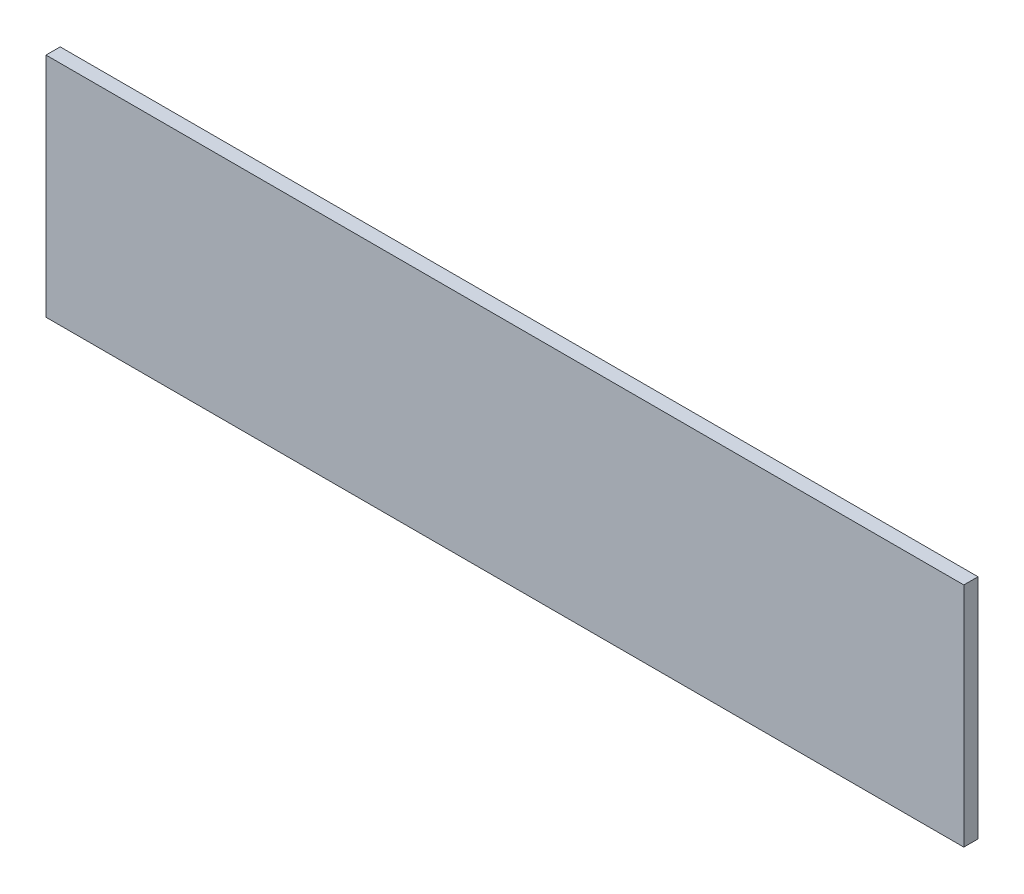
ISO-10303-21;
HEADER;
FILE_DESCRIPTION(('STEP AP214'),'2;1');
FILE_NAME('part.step','',(''),(''),'','','');
FILE_SCHEMA(('AUTOMOTIVE_DESIGN { 1 0 10303 214 1 1 1 1 }'));
ENDSEC;
DATA;
#1=APPLICATION_CONTEXT('core data for automotive mechanical design processes');
#2=APPLICATION_PROTOCOL_DEFINITION('international standard','automotive_design',2000,#1);
#3=PRODUCT_CONTEXT('',#1,'mechanical');
#4=PRODUCT('Part','Part','',(#3));
#5=PRODUCT_RELATED_PRODUCT_CATEGORY('part','',(#4));
#6=PRODUCT_DEFINITION_FORMATION('','',#4);
#7=PRODUCT_DEFINITION_CONTEXT('part definition',#1,'design');
#8=PRODUCT_DEFINITION('design','',#6,#7);
#9=PRODUCT_DEFINITION_SHAPE('','',#8);
#10=(LENGTH_UNIT() NAMED_UNIT(*) SI_UNIT(.MILLI.,.METRE.));
#11=(NAMED_UNIT(*) PLANE_ANGLE_UNIT() SI_UNIT($,.RADIAN.));
#12=(NAMED_UNIT(*) SI_UNIT($,.STERADIAN.) SOLID_ANGLE_UNIT());
#13=UNCERTAINTY_MEASURE_WITH_UNIT(LENGTH_MEASURE(1.E-05),#10,'distance_accuracy_value','');
#14=(GEOMETRIC_REPRESENTATION_CONTEXT(3) GLOBAL_UNCERTAINTY_ASSIGNED_CONTEXT((#13)) GLOBAL_UNIT_ASSIGNED_CONTEXT((#10,
#11,#12)) REPRESENTATION_CONTEXT('',''));
#15=CARTESIAN_POINT('',(0.,0.,0.));
#16=DIRECTION('',(0.,0.,1.));
#17=DIRECTION('',(1.,0.,0.));
#18=AXIS2_PLACEMENT_3D('',#15,#16,#17);
#19=CARTESIAN_POINT('',(-48.5,-12.,1.5));
#20=DIRECTION('',(1.,0.,0.));
#21=DIRECTION('',(0.,0.,-1.));
#22=AXIS2_PLACEMENT_3D('',#19,#20,#21);
#23=PLANE('',#22);
#24=DIRECTION('',(0.,-1.,0.));
#25=VECTOR('',#24,1.);
#26=CARTESIAN_POINT('',(-48.5,-12.,0.));
#27=LINE('',#26,#25);
#28=CARTESIAN_POINT('',(-48.5,12.,0.));
#29=VERTEX_POINT('',#28);
#30=CARTESIAN_POINT('',(-48.5,-12.,0.));
#31=VERTEX_POINT('',#30);
#32=EDGE_CURVE('E100',#29,#31,#27,.T.);
#33=ORIENTED_EDGE('',*,*,#32,.T.);
#34=DIRECTION('',(0.,0.,-1.));
#35=VECTOR('',#34,1.);
#36=CARTESIAN_POINT('',(-48.5,-12.,1.5));
#37=LINE('',#36,#35);
#38=CARTESIAN_POINT('',(-48.5,-12.,1.5));
#39=VERTEX_POINT('',#38);
#40=EDGE_CURVE('E11',#39,#31,#37,.T.);
#41=ORIENTED_EDGE('',*,*,#40,.F.);
#42=DIRECTION('',(0.,-1.,0.));
#43=VECTOR('',#42,1.);
#44=CARTESIAN_POINT('',(-48.5,-12.,1.5));
#45=LINE('',#44,#43);
#46=CARTESIAN_POINT('',(-48.5,12.,1.5));
#47=VERTEX_POINT('',#46);
#48=EDGE_CURVE('E88',#47,#39,#45,.T.);
#49=ORIENTED_EDGE('',*,*,#48,.F.);
#50=DIRECTION('',(0.,0.,-1.));
#51=VECTOR('',#50,1.);
#52=CARTESIAN_POINT('',(-48.5,12.,1.5));
#53=LINE('',#52,#51);
#54=EDGE_CURVE('E96',#47,#29,#53,.T.);
#55=ORIENTED_EDGE('',*,*,#54,.T.);
#56=EDGE_LOOP('',(#33,#41,#49,#55));
#57=FACE_BOUND('',#56,.T.);
#58=ADVANCED_FACE('F37',(#57),#23,.F.);
#59=CARTESIAN_POINT('',(48.5,-12.,1.5));
#60=DIRECTION('',(0.,1.,0.));
#61=DIRECTION('',(-1.,0.,0.));
#62=AXIS2_PLACEMENT_3D('',#59,#60,#61);
#63=PLANE('',#62);
#64=DIRECTION('',(1.,0.,0.));
#65=VECTOR('',#64,1.);
#66=CARTESIAN_POINT('',(48.5,-12.,0.));
#67=LINE('',#66,#65);
#68=CARTESIAN_POINT('',(48.5,-12.,0.));
#69=VERTEX_POINT('',#68);
#70=EDGE_CURVE('E92',#31,#69,#67,.T.);
#71=ORIENTED_EDGE('',*,*,#70,.T.);
#72=DIRECTION('',(0.,0.,-1.));
#73=VECTOR('',#72,1.);
#74=CARTESIAN_POINT('',(48.5,-12.,1.5));
#75=LINE('',#74,#73);
#76=CARTESIAN_POINT('',(48.5,-12.,1.5));
#77=VERTEX_POINT('',#76);
#78=EDGE_CURVE('E45',#77,#69,#75,.T.);
#79=ORIENTED_EDGE('',*,*,#78,.F.);
#80=DIRECTION('',(1.,0.,0.));
#81=VECTOR('',#80,1.);
#82=CARTESIAN_POINT('',(48.5,-12.,1.5));
#83=LINE('',#82,#81);
#84=EDGE_CURVE('E83',#39,#77,#83,.T.);
#85=ORIENTED_EDGE('',*,*,#84,.F.);
#86=ORIENTED_EDGE('',*,*,#40,.T.);
#87=EDGE_LOOP('',(#71,#79,#85,#86));
#88=FACE_BOUND('',#87,.T.);
#89=ADVANCED_FACE('F91',(#88),#63,.F.);
#90=CARTESIAN_POINT('',(48.5,-12.,1.5));
#91=DIRECTION('',(-1.,0.,0.));
#92=DIRECTION('',(0.,0.,1.));
#93=AXIS2_PLACEMENT_3D('',#90,#91,#92);
#94=PLANE('',#93);
#95=DIRECTION('',(0.,1.,0.));
#96=VECTOR('',#95,1.);
#97=CARTESIAN_POINT('',(48.5,-12.,0.));
#98=LINE('',#97,#96);
#99=CARTESIAN_POINT('',(48.5,12.,0.));
#100=VERTEX_POINT('',#99);
#101=EDGE_CURVE('E70',#69,#100,#98,.T.);
#102=ORIENTED_EDGE('',*,*,#101,.T.);
#103=DIRECTION('',(0.,0.,-1.));
#104=VECTOR('',#103,1.);
#105=CARTESIAN_POINT('',(48.5,12.,1.5));
#106=LINE('',#105,#104);
#107=CARTESIAN_POINT('',(48.5,12.,1.5));
#108=VERTEX_POINT('',#107);
#109=EDGE_CURVE('E93',#108,#100,#106,.T.);
#110=ORIENTED_EDGE('',*,*,#109,.F.);
#111=DIRECTION('',(0.,1.,0.));
#112=VECTOR('',#111,1.);
#113=CARTESIAN_POINT('',(48.5,-12.,1.5));
#114=LINE('',#113,#112);
#115=EDGE_CURVE('E86',#77,#108,#114,.T.);
#116=ORIENTED_EDGE('',*,*,#115,.F.);
#117=ORIENTED_EDGE('',*,*,#78,.T.);
#118=EDGE_LOOP('',(#102,#110,#116,#117));
#119=FACE_BOUND('',#118,.T.);
#120=ADVANCED_FACE('F94',(#119),#94,.F.);
#121=CARTESIAN_POINT('',(48.5,12.,1.5));
#122=DIRECTION('',(0.,-1.,0.));
#123=DIRECTION('',(1.,0.,0.));
#124=AXIS2_PLACEMENT_3D('',#121,#122,#123);
#125=PLANE('',#124);
#126=DIRECTION('',(-1.,0.,0.));
#127=VECTOR('',#126,1.);
#128=CARTESIAN_POINT('',(48.5,12.,0.));
#129=LINE('',#128,#127);
#130=EDGE_CURVE('E76',#100,#29,#129,.T.);
#131=ORIENTED_EDGE('',*,*,#130,.T.);
#132=ORIENTED_EDGE('',*,*,#54,.F.);
#133=DIRECTION('',(-1.,0.,0.));
#134=VECTOR('',#133,1.);
#135=CARTESIAN_POINT('',(48.5,12.,1.5));
#136=LINE('',#135,#134);
#137=EDGE_CURVE('E53',#108,#47,#136,.T.);
#138=ORIENTED_EDGE('',*,*,#137,.F.);
#139=ORIENTED_EDGE('',*,*,#109,.T.);
#140=EDGE_LOOP('',(#131,#132,#138,#139));
#141=FACE_BOUND('',#140,.T.);
#142=ADVANCED_FACE('F107',(#141),#125,.F.);
#143=CARTESIAN_POINT('',(0.,0.,1.5));
#144=DIRECTION('',(0.,0.,1.));
#145=DIRECTION('',(1.,0.,0.));
#146=AXIS2_PLACEMENT_3D('',#143,#144,#145);
#147=PLANE('',#146);
#148=ORIENTED_EDGE('',*,*,#48,.T.);
#149=ORIENTED_EDGE('',*,*,#84,.T.);
#150=ORIENTED_EDGE('',*,*,#115,.T.);
#151=ORIENTED_EDGE('',*,*,#137,.T.);
#152=EDGE_LOOP('',(#148,#149,#150,#151));
#153=FACE_BOUND('',#152,.T.);
#154=ADVANCED_FACE('F84',(#153),#147,.T.);
#155=CARTESIAN_POINT('',(0.,0.,0.));
#156=DIRECTION('',(0.,0.,1.));
#157=DIRECTION('',(1.,0.,0.));
#158=AXIS2_PLACEMENT_3D('',#155,#156,#157);
#159=PLANE('',#158);
#160=ORIENTED_EDGE('',*,*,#32,.F.);
#161=ORIENTED_EDGE('',*,*,#130,.F.);
#162=ORIENTED_EDGE('',*,*,#101,.F.);
#163=ORIENTED_EDGE('',*,*,#70,.F.);
#164=EDGE_LOOP('',(#160,#161,#162,#163));
#165=FACE_BOUND('',#164,.T.);
#166=ADVANCED_FACE('F110',(#165),#159,.F.);
#167=CLOSED_SHELL('',(#58,#89,#120,#142,#154,#166));
#168=MANIFOLD_SOLID_BREP('B2',#167);
#169=ADVANCED_BREP_SHAPE_REPRESENTATION('',(#18,#168),#14);
#170=SHAPE_DEFINITION_REPRESENTATION(#9,#169);
ENDSEC;
END-ISO-10303-21;
